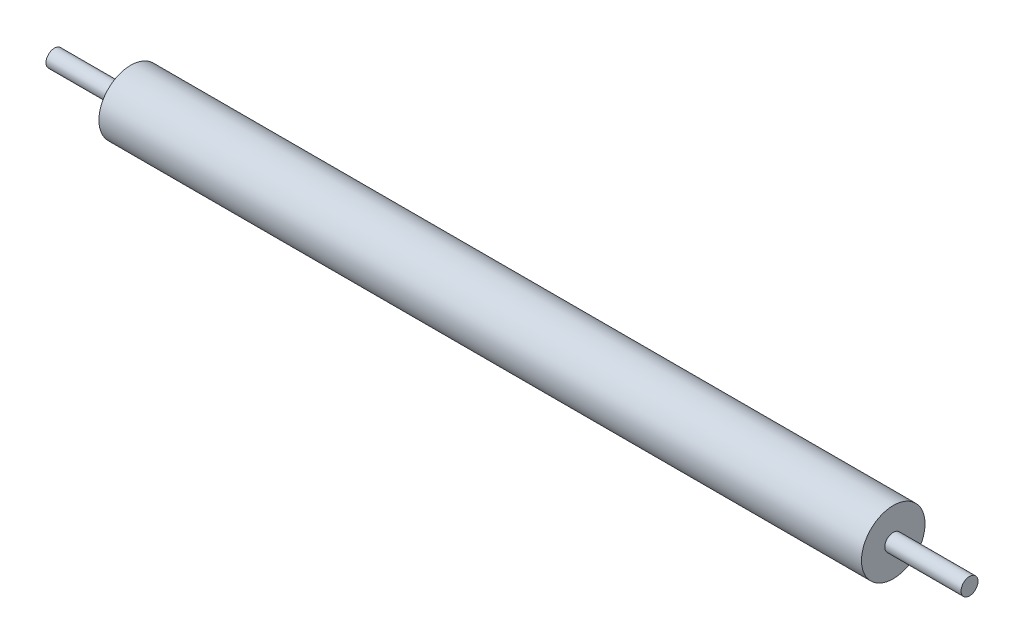
ISO-10303-21;
HEADER;
FILE_DESCRIPTION(('STEP AP214'),'2;1');
FILE_NAME('part.step','',(''),(''),'','','');
FILE_SCHEMA(('AUTOMOTIVE_DESIGN { 1 0 10303 214 1 1 1 1 }'));
ENDSEC;
DATA;
#1=APPLICATION_CONTEXT('core data for automotive mechanical design processes');
#2=APPLICATION_PROTOCOL_DEFINITION('international standard','automotive_design',2000,#1);
#3=PRODUCT_CONTEXT('',#1,'mechanical');
#4=PRODUCT('Part','Part','',(#3));
#5=PRODUCT_RELATED_PRODUCT_CATEGORY('part','',(#4));
#6=PRODUCT_DEFINITION_FORMATION('','',#4);
#7=PRODUCT_DEFINITION_CONTEXT('part definition',#1,'design');
#8=PRODUCT_DEFINITION('design','',#6,#7);
#9=PRODUCT_DEFINITION_SHAPE('','',#8);
#10=(LENGTH_UNIT() NAMED_UNIT(*) SI_UNIT(.MILLI.,.METRE.));
#11=(NAMED_UNIT(*) PLANE_ANGLE_UNIT() SI_UNIT($,.RADIAN.));
#12=(NAMED_UNIT(*) SI_UNIT($,.STERADIAN.) SOLID_ANGLE_UNIT());
#13=UNCERTAINTY_MEASURE_WITH_UNIT(LENGTH_MEASURE(1.E-05),#10,'distance_accuracy_value','');
#14=(GEOMETRIC_REPRESENTATION_CONTEXT(3) GLOBAL_UNCERTAINTY_ASSIGNED_CONTEXT((#13)) GLOBAL_UNIT_ASSIGNED_CONTEXT((#10,
#11,#12)) REPRESENTATION_CONTEXT('',''));
#15=CARTESIAN_POINT('',(0.,0.,0.));
#16=DIRECTION('',(0.,0.,1.));
#17=DIRECTION('',(1.,0.,0.));
#18=AXIS2_PLACEMENT_3D('',#15,#16,#17);
#19=CARTESIAN_POINT('',(180.,0.,0.));
#20=DIRECTION('',(-1.,0.,0.));
#21=DIRECTION('',(0.,0.,1.));
#22=AXIS2_PLACEMENT_3D('',#19,#20,#21);
#23=CYLINDRICAL_SURFACE('',#22,15.);
#24=CARTESIAN_POINT('',(180.,0.,0.));
#25=DIRECTION('',(1.,0.,0.));
#26=DIRECTION('',(0.,0.,-1.));
#27=AXIS2_PLACEMENT_3D('',#24,#25,#26);
#28=CIRCLE('',#27,15.);
#29=CARTESIAN_POINT('',(180.,0.,15.));
#30=VERTEX_POINT('',#29);
#31=EDGE_CURVE('E37',#30,#30,#28,.T.);
#32=CARTESIAN_POINT('',(-180.,0.,0.));
#33=DIRECTION('',(1.,0.,0.));
#34=DIRECTION('',(0.,0.,-1.));
#35=AXIS2_PLACEMENT_3D('',#32,#33,#34);
#36=CIRCLE('',#35,15.);
#37=CARTESIAN_POINT('',(-180.,0.,15.));
#38=VERTEX_POINT('',#37);
#39=EDGE_CURVE('E49',#38,#38,#36,.T.);
#40=CARTESIAN_POINT('',(180.,0.,15.));
#41=CARTESIAN_POINT('',(176.25,0.,15.));
#42=CARTESIAN_POINT('',(172.5,0.,15.));
#43=CARTESIAN_POINT('',(165.,0.,15.));
#44=CARTESIAN_POINT('',(161.25,0.,15.));
#45=CARTESIAN_POINT('',(153.75,0.,15.));
#46=CARTESIAN_POINT('',(150.,0.,15.));
#47=CARTESIAN_POINT('',(142.5,0.,15.));
#48=CARTESIAN_POINT('',(138.75,0.,15.));
#49=CARTESIAN_POINT('',(131.25,0.,15.));
#50=CARTESIAN_POINT('',(127.5,0.,15.));
#51=CARTESIAN_POINT('',(120.,0.,15.));
#52=CARTESIAN_POINT('',(116.25,0.,15.));
#53=CARTESIAN_POINT('',(108.75,0.,15.));
#54=CARTESIAN_POINT('',(105.,0.,15.));
#55=CARTESIAN_POINT('',(97.5,0.,15.));
#56=CARTESIAN_POINT('',(93.75,0.,15.));
#57=CARTESIAN_POINT('',(86.25,0.,15.));
#58=CARTESIAN_POINT('',(82.5,0.,15.));
#59=CARTESIAN_POINT('',(75.,0.,15.));
#60=CARTESIAN_POINT('',(71.25,0.,15.));
#61=CARTESIAN_POINT('',(63.75,0.,15.));
#62=CARTESIAN_POINT('',(60.,0.,15.));
#63=CARTESIAN_POINT('',(52.5,0.,15.));
#64=CARTESIAN_POINT('',(48.75,0.,15.));
#65=CARTESIAN_POINT('',(41.25,0.,15.));
#66=CARTESIAN_POINT('',(37.5,0.,15.));
#67=CARTESIAN_POINT('',(30.,0.,15.));
#68=CARTESIAN_POINT('',(26.25,0.,15.));
#69=CARTESIAN_POINT('',(18.75,0.,15.));
#70=CARTESIAN_POINT('',(15.,0.,15.));
#71=CARTESIAN_POINT('',(7.49999999999998,0.,15.));
#72=CARTESIAN_POINT('',(3.74999999999998,0.,15.));
#73=CARTESIAN_POINT('',(-3.75000000000003,0.,15.));
#74=CARTESIAN_POINT('',(-7.50000000000003,0.,15.));
#75=CARTESIAN_POINT('',(-15.,0.,15.));
#76=CARTESIAN_POINT('',(-18.75,0.,15.));
#77=CARTESIAN_POINT('',(-26.25,0.,15.));
#78=CARTESIAN_POINT('',(-30.,0.,15.));
#79=CARTESIAN_POINT('',(-37.5,0.,15.));
#80=CARTESIAN_POINT('',(-41.25,0.,15.));
#81=CARTESIAN_POINT('',(-48.75,0.,15.));
#82=CARTESIAN_POINT('',(-52.5,0.,15.));
#83=CARTESIAN_POINT('',(-60.,0.,15.));
#84=CARTESIAN_POINT('',(-63.75,0.,15.));
#85=CARTESIAN_POINT('',(-71.25,0.,15.));
#86=CARTESIAN_POINT('',(-75.,0.,15.));
#87=CARTESIAN_POINT('',(-82.5,0.,15.));
#88=CARTESIAN_POINT('',(-86.25,0.,15.));
#89=CARTESIAN_POINT('',(-93.75,0.,15.));
#90=CARTESIAN_POINT('',(-97.5,0.,15.));
#91=CARTESIAN_POINT('',(-105.,0.,15.));
#92=CARTESIAN_POINT('',(-108.75,0.,15.));
#93=CARTESIAN_POINT('',(-116.25,0.,15.));
#94=CARTESIAN_POINT('',(-120.,0.,15.));
#95=CARTESIAN_POINT('',(-127.5,0.,15.));
#96=CARTESIAN_POINT('',(-131.25,0.,15.));
#97=CARTESIAN_POINT('',(-138.75,0.,15.));
#98=CARTESIAN_POINT('',(-142.5,0.,15.));
#99=CARTESIAN_POINT('',(-150.,0.,15.));
#100=CARTESIAN_POINT('',(-153.75,0.,15.));
#101=CARTESIAN_POINT('',(-161.25,0.,15.));
#102=CARTESIAN_POINT('',(-165.,0.,15.));
#103=CARTESIAN_POINT('',(-172.5,0.,15.));
#104=CARTESIAN_POINT('',(-176.25,0.,15.));
#105=CARTESIAN_POINT('',(-180.,0.,15.));
#106=B_SPLINE_CURVE_WITH_KNOTS('',3,(#40,#41,#42,#43,#44,#45,#46,#47,#48,#49,#50,#51,#52,#53,
#54,#55,#56,#57,#58,#59,#60,#61,#62,#63,#64,#65,#66,#67,#68,#69,#70,#71,#72,#73,#74,#75,#76,#77,
#78,#79,#80,#81,#82,#83,#84,#85,#86,#87,#88,#89,#90,#91,#92,#93,#94,#95,#96,#97,#98,#99,#100,
#101,#102,#103,#104,#105),.UNSPECIFIED.,.F.,.F.,(4,2,2,2,2,2,2,2,2,2,2,2,2,2,2,2,2,2,2,2,2,2,2,
2,2,2,2,2,2,2,2,2,4),(0.,11.25,22.5,33.75,45.,56.25,67.5,78.75,90.,101.25,112.5,123.75,135.,
146.25,157.5,168.75,180.,191.25,202.5,213.75,225.,236.25,247.5,258.75,270.,281.25,292.5,303.75,
315.,326.25,337.5,348.75,360.),.UNSPECIFIED.);
#107=EDGE_CURVE('BSEAM31',#30,#38,#106,.T.);
#108=ORIENTED_EDGE('',*,*,#31,.F.);
#109=ORIENTED_EDGE('',*,*,#39,.T.);
#110=ORIENTED_EDGE('',*,*,#107,.T.);
#111=ORIENTED_EDGE('',*,*,#107,.F.);
#112=EDGE_LOOP('',(#108,#110,#109,#111));
#113=FACE_BOUND('',#112,.T.);
#114=ADVANCED_FACE('F31',(#113),#23,.T.);
#115=CARTESIAN_POINT('',(180.,0.,0.));
#116=DIRECTION('',(1.,0.,0.));
#117=DIRECTION('',(0.,0.,-1.));
#118=AXIS2_PLACEMENT_3D('',#115,#116,#117);
#119=PLANE('',#118);
#120=CARTESIAN_POINT('',(180.,0.,0.));
#121=DIRECTION('',(1.,0.,0.));
#122=DIRECTION('',(0.,0.,-1.));
#123=AXIS2_PLACEMENT_3D('',#120,#121,#122);
#124=CIRCLE('',#123,4.);
#125=CARTESIAN_POINT('',(180.,0.,-4.));
#126=VERTEX_POINT('',#125);
#127=EDGE_CURVE('E45',#126,#126,#124,.T.);
#128=ORIENTED_EDGE('',*,*,#127,.F.);
#129=EDGE_LOOP('',(#128));
#130=FACE_BOUND('',#129,.T.);
#131=ORIENTED_EDGE('',*,*,#31,.T.);
#132=EDGE_LOOP('',(#131));
#133=FACE_BOUND('',#132,.T.);
#134=ADVANCED_FACE('F68',(#130,#133),#119,.T.);
#135=CARTESIAN_POINT('',(216.,0.,0.));
#136=DIRECTION('',(-1.,0.,0.));
#137=DIRECTION('',(0.,0.,1.));
#138=AXIS2_PLACEMENT_3D('',#135,#136,#137);
#139=CYLINDRICAL_SURFACE('',#138,4.);
#140=CARTESIAN_POINT('',(216.,0.,0.));
#141=DIRECTION('',(1.,0.,0.));
#142=DIRECTION('',(0.,0.,-1.));
#143=AXIS2_PLACEMENT_3D('',#140,#141,#142);
#144=CIRCLE('',#143,4.);
#145=CARTESIAN_POINT('',(216.,0.,-4.));
#146=VERTEX_POINT('',#145);
#147=EDGE_CURVE('E41',#146,#146,#144,.T.);
#148=ORIENTED_EDGE('',*,*,#147,.F.);
#149=EDGE_LOOP('',(#148));
#150=FACE_BOUND('',#149,.T.);
#151=ORIENTED_EDGE('',*,*,#127,.T.);
#152=EDGE_LOOP('',(#151));
#153=FACE_BOUND('',#152,.T.);
#154=ADVANCED_FACE('F73',(#150,#153),#139,.T.);
#155=CARTESIAN_POINT('',(216.,0.,0.));
#156=DIRECTION('',(1.,0.,0.));
#157=DIRECTION('',(0.,0.,-1.));
#158=AXIS2_PLACEMENT_3D('',#155,#156,#157);
#159=PLANE('',#158);
#160=ORIENTED_EDGE('',*,*,#147,.T.);
#161=EDGE_LOOP('',(#160));
#162=FACE_BOUND('',#161,.T.);
#163=ADVANCED_FACE('F79',(#162),#159,.T.);
#164=CARTESIAN_POINT('',(-180.,0.,0.));
#165=DIRECTION('',(-1.,0.,0.));
#166=DIRECTION('',(0.,0.,-1.));
#167=AXIS2_PLACEMENT_3D('',#164,#165,#166);
#168=PLANE('',#167);
#169=CARTESIAN_POINT('',(-180.,0.,0.));
#170=DIRECTION('',(-1.,0.,0.));
#171=DIRECTION('',(0.,0.,1.));
#172=AXIS2_PLACEMENT_3D('',#169,#170,#171);
#173=CIRCLE('',#172,4.);
#174=CARTESIAN_POINT('',(-180.,0.,4.));
#175=VERTEX_POINT('',#174);
#176=EDGE_CURVE('E10',#175,#175,#173,.T.);
#177=ORIENTED_EDGE('',*,*,#176,.F.);
#178=EDGE_LOOP('',(#177));
#179=FACE_BOUND('',#178,.T.);
#180=ORIENTED_EDGE('',*,*,#39,.F.);
#181=EDGE_LOOP('',(#180));
#182=FACE_BOUND('',#181,.T.);
#183=ADVANCED_FACE('F65',(#179,#182),#168,.T.);
#184=CARTESIAN_POINT('',(-216.,0.,0.));
#185=DIRECTION('',(1.,0.,0.));
#186=DIRECTION('',(0.,0.,-1.));
#187=AXIS2_PLACEMENT_3D('',#184,#185,#186);
#188=CYLINDRICAL_SURFACE('',#187,4.);
#189=CARTESIAN_POINT('',(-216.,0.,0.));
#190=DIRECTION('',(1.,0.,0.));
#191=DIRECTION('',(0.,0.,-1.));
#192=AXIS2_PLACEMENT_3D('',#189,#190,#191);
#193=CIRCLE('',#192,4.);
#194=CARTESIAN_POINT('',(-216.,0.,-4.));
#195=VERTEX_POINT('',#194);
#196=EDGE_CURVE('E53',#195,#195,#193,.T.);
#197=ORIENTED_EDGE('',*,*,#196,.T.);
#198=EDGE_LOOP('',(#197));
#199=FACE_BOUND('',#198,.T.);
#200=ORIENTED_EDGE('',*,*,#176,.T.);
#201=EDGE_LOOP('',(#200));
#202=FACE_BOUND('',#201,.T.);
#203=ADVANCED_FACE('F57',(#199,#202),#188,.T.);
#204=CARTESIAN_POINT('',(-216.,0.,0.));
#205=DIRECTION('',(-1.,0.,0.));
#206=DIRECTION('',(0.,0.,-1.));
#207=AXIS2_PLACEMENT_3D('',#204,#205,#206);
#208=PLANE('',#207);
#209=ORIENTED_EDGE('',*,*,#196,.F.);
#210=EDGE_LOOP('',(#209));
#211=FACE_BOUND('',#210,.T.);
#212=ADVANCED_FACE('F59',(#211),#208,.T.);
#213=CLOSED_SHELL('',(#114,#134,#154,#163,#183,#203,#212));
#214=MANIFOLD_SOLID_BREP('B2',#213);
#215=ADVANCED_BREP_SHAPE_REPRESENTATION('',(#18,#214),#14);
#216=SHAPE_DEFINITION_REPRESENTATION(#9,#215);
ENDSEC;
END-ISO-10303-21;
